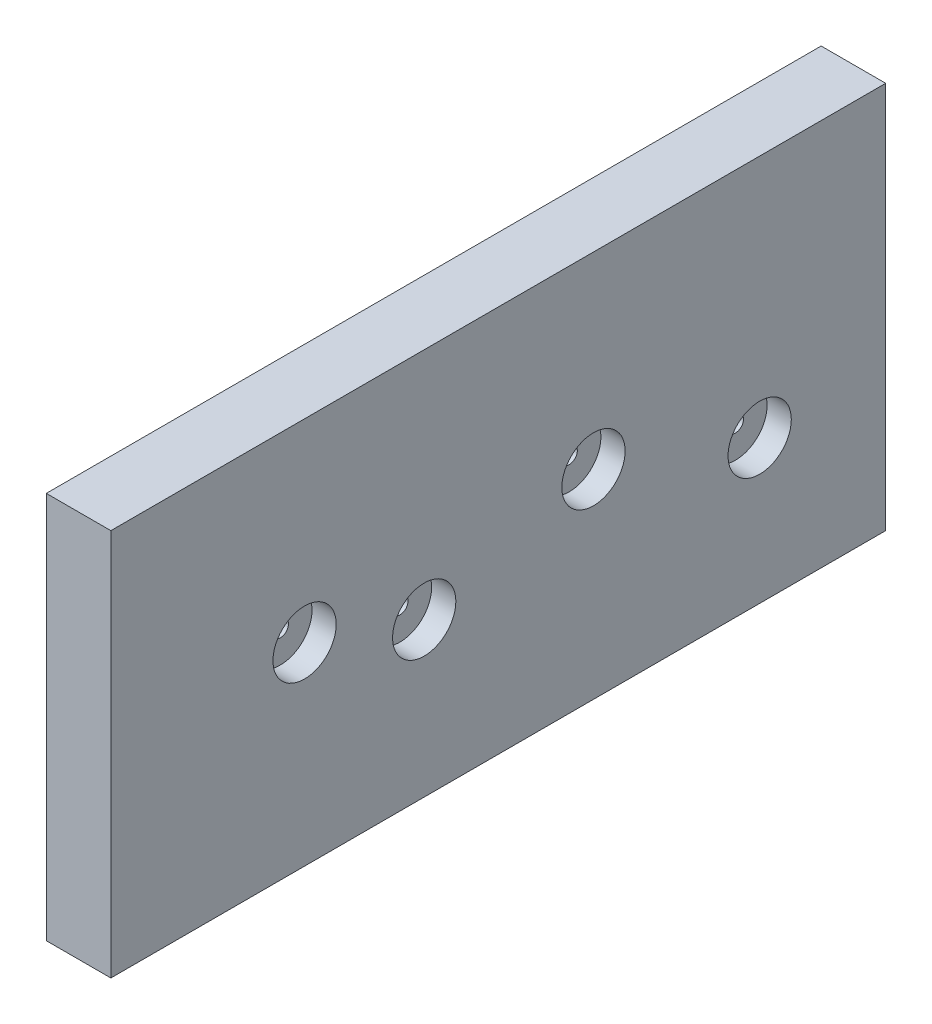
ISO-10303-21;
HEADER;
FILE_DESCRIPTION(('STEP AP214'),'2;1');
FILE_NAME('part.step','',(''),(''),'','','');
FILE_SCHEMA(('AUTOMOTIVE_DESIGN { 1 0 10303 214 1 1 1 1 }'));
ENDSEC;
DATA;
#1=APPLICATION_CONTEXT('core data for automotive mechanical design processes');
#2=APPLICATION_PROTOCOL_DEFINITION('international standard','automotive_design',2000,#1);
#3=PRODUCT_CONTEXT('',#1,'mechanical');
#4=PRODUCT('Part','Part','',(#3));
#5=PRODUCT_RELATED_PRODUCT_CATEGORY('part','',(#4));
#6=PRODUCT_DEFINITION_FORMATION('','',#4);
#7=PRODUCT_DEFINITION_CONTEXT('part definition',#1,'design');
#8=PRODUCT_DEFINITION('design','',#6,#7);
#9=PRODUCT_DEFINITION_SHAPE('','',#8);
#10=(LENGTH_UNIT() NAMED_UNIT(*) SI_UNIT(.MILLI.,.METRE.));
#11=(NAMED_UNIT(*) PLANE_ANGLE_UNIT() SI_UNIT($,.RADIAN.));
#12=(NAMED_UNIT(*) SI_UNIT($,.STERADIAN.) SOLID_ANGLE_UNIT());
#13=UNCERTAINTY_MEASURE_WITH_UNIT(LENGTH_MEASURE(1.E-05),#10,'distance_accuracy_value','');
#14=(GEOMETRIC_REPRESENTATION_CONTEXT(3) GLOBAL_UNCERTAINTY_ASSIGNED_CONTEXT((#13)) GLOBAL_UNIT_ASSIGNED_CONTEXT((#10,
#11,#12)) REPRESENTATION_CONTEXT('',''));
#15=CARTESIAN_POINT('',(0.,0.,0.));
#16=DIRECTION('',(0.,0.,1.));
#17=DIRECTION('',(1.,0.,0.));
#18=AXIS2_PLACEMENT_3D('',#15,#16,#17);
#19=CARTESIAN_POINT('',(12.7,-38.1,0.));
#20=DIRECTION('',(0.,1.,0.));
#21=DIRECTION('',(0.,0.,1.));
#22=AXIS2_PLACEMENT_3D('',#19,#20,#21);
#23=PLANE('',#22);
#24=CARTESIAN_POINT('',(6.35000000000001,-38.1,0.));
#25=DIRECTION('',(0.,-1.,0.));
#26=DIRECTION('',(0.,0.,-1.));
#27=AXIS2_PLACEMENT_3D('',#24,#25,#26);
#28=CIRCLE('',#27,3.175);
#29=CARTESIAN_POINT('',(6.35000000000001,-38.1,-3.175));
#30=VERTEX_POINT('',#29);
#31=EDGE_CURVE('E107',#30,#30,#28,.T.);
#32=ORIENTED_EDGE('',*,*,#31,.F.);
#33=EDGE_LOOP('',(#32));
#34=FACE_BOUND('',#33,.T.);
#35=CARTESIAN_POINT('',(6.35,-38.1,57.15));
#36=DIRECTION('',(0.,-1.,0.));
#37=DIRECTION('',(0.,0.,-1.));
#38=AXIS2_PLACEMENT_3D('',#35,#36,#37);
#39=CIRCLE('',#38,3.175);
#40=CARTESIAN_POINT('',(6.35,-38.1,53.975));
#41=VERTEX_POINT('',#40);
#42=EDGE_CURVE('E106',#41,#41,#39,.T.);
#43=ORIENTED_EDGE('',*,*,#42,.F.);
#44=EDGE_LOOP('',(#43));
#45=FACE_BOUND('',#44,.T.);
#46=CARTESIAN_POINT('',(6.35000000000002,-38.1,-63.5));
#47=DIRECTION('',(0.,-1.,0.));
#48=DIRECTION('',(0.,0.,-1.));
#49=AXIS2_PLACEMENT_3D('',#46,#47,#48);
#50=CIRCLE('',#49,3.175);
#51=CARTESIAN_POINT('',(6.35000000000002,-38.1,-66.675));
#52=VERTEX_POINT('',#51);
#53=EDGE_CURVE('E117',#52,#52,#50,.T.);
#54=ORIENTED_EDGE('',*,*,#53,.F.);
#55=EDGE_LOOP('',(#54));
#56=FACE_BOUND('',#55,.T.);
#57=DIRECTION('',(0.,0.,-1.));
#58=VECTOR('',#57,1.);
#59=CARTESIAN_POINT('',(0.,-38.1,0.));
#60=LINE('',#59,#58);
#61=CARTESIAN_POINT('',(0.,-38.1,76.2));
#62=VERTEX_POINT('',#61);
#63=CARTESIAN_POINT('',(0.,-38.1,-76.2));
#64=VERTEX_POINT('',#63);
#65=EDGE_CURVE('E157',#62,#64,#60,.T.);
#66=ORIENTED_EDGE('',*,*,#65,.T.);
#67=DIRECTION('',(-1.,0.,0.));
#68=VECTOR('',#67,1.);
#69=CARTESIAN_POINT('',(12.7,-38.1,-76.2));
#70=LINE('',#69,#68);
#71=CARTESIAN_POINT('',(12.7,-38.1,-76.2));
#72=VERTEX_POINT('',#71);
#73=EDGE_CURVE('E11',#72,#64,#70,.T.);
#74=ORIENTED_EDGE('',*,*,#73,.F.);
#75=DIRECTION('',(0.,0.,-1.));
#76=VECTOR('',#75,1.);
#77=CARTESIAN_POINT('',(12.7,-38.1,0.));
#78=LINE('',#77,#76);
#79=CARTESIAN_POINT('',(12.7,-38.1,76.2));
#80=VERTEX_POINT('',#79);
#81=EDGE_CURVE('E148',#80,#72,#78,.T.);
#82=ORIENTED_EDGE('',*,*,#81,.F.);
#83=DIRECTION('',(-1.,0.,0.));
#84=VECTOR('',#83,1.);
#85=CARTESIAN_POINT('',(12.7,-38.1,76.2));
#86=LINE('',#85,#84);
#87=EDGE_CURVE('E59',#80,#62,#86,.T.);
#88=ORIENTED_EDGE('',*,*,#87,.T.);
#89=EDGE_LOOP('',(#66,#74,#82,#88));
#90=FACE_BOUND('',#89,.T.);
#91=ADVANCED_FACE('F41',(#34,#45,#56,#90),#23,.F.);
#92=CARTESIAN_POINT('',(12.7,0.,-76.2));
#93=DIRECTION('',(0.,0.,1.));
#94=DIRECTION('',(1.,0.,0.));
#95=AXIS2_PLACEMENT_3D('',#92,#93,#94);
#96=PLANE('',#95);
#97=DIRECTION('',(0.,1.,0.));
#98=VECTOR('',#97,1.);
#99=CARTESIAN_POINT('',(0.,0.,-76.2));
#100=LINE('',#99,#98);
#101=CARTESIAN_POINT('',(0.,38.1,-76.2));
#102=VERTEX_POINT('',#101);
#103=EDGE_CURVE('E159',#64,#102,#100,.T.);
#104=ORIENTED_EDGE('',*,*,#103,.T.);
#105=DIRECTION('',(-1.,0.,0.));
#106=VECTOR('',#105,1.);
#107=CARTESIAN_POINT('',(12.7,38.1,-76.2));
#108=LINE('',#107,#106);
#109=CARTESIAN_POINT('',(12.7,38.1,-76.2));
#110=VERTEX_POINT('',#109);
#111=EDGE_CURVE('E50',#110,#102,#108,.T.);
#112=ORIENTED_EDGE('',*,*,#111,.F.);
#113=DIRECTION('',(0.,1.,0.));
#114=VECTOR('',#113,1.);
#115=CARTESIAN_POINT('',(12.7,0.,-76.2));
#116=LINE('',#115,#114);
#117=EDGE_CURVE('E85',#72,#110,#116,.T.);
#118=ORIENTED_EDGE('',*,*,#117,.F.);
#119=ORIENTED_EDGE('',*,*,#73,.T.);
#120=EDGE_LOOP('',(#104,#112,#118,#119));
#121=FACE_BOUND('',#120,.T.);
#122=ADVANCED_FACE('F229',(#121),#96,.F.);
#123=CARTESIAN_POINT('',(12.7,38.1,0.));
#124=DIRECTION('',(0.,1.,0.));
#125=DIRECTION('',(0.,0.,1.));
#126=AXIS2_PLACEMENT_3D('',#123,#124,#125);
#127=PLANE('',#126);
#128=DIRECTION('',(0.,0.,-1.));
#129=VECTOR('',#128,1.);
#130=CARTESIAN_POINT('',(0.,38.1,0.));
#131=LINE('',#130,#129);
#132=CARTESIAN_POINT('',(0.,38.1,76.2));
#133=VERTEX_POINT('',#132);
#134=EDGE_CURVE('E162',#133,#102,#131,.T.);
#135=ORIENTED_EDGE('',*,*,#134,.F.);
#136=DIRECTION('',(-1.,0.,0.));
#137=VECTOR('',#136,1.);
#138=CARTESIAN_POINT('',(12.7,38.1,76.2));
#139=LINE('',#138,#137);
#140=CARTESIAN_POINT('',(12.7,38.1,76.2));
#141=VERTEX_POINT('',#140);
#142=EDGE_CURVE('E74',#141,#133,#139,.T.);
#143=ORIENTED_EDGE('',*,*,#142,.F.);
#144=DIRECTION('',(0.,0.,-1.));
#145=VECTOR('',#144,1.);
#146=CARTESIAN_POINT('',(12.7,38.1,0.));
#147=LINE('',#146,#145);
#148=EDGE_CURVE('E152',#141,#110,#147,.T.);
#149=ORIENTED_EDGE('',*,*,#148,.T.);
#150=ORIENTED_EDGE('',*,*,#111,.T.);
#151=EDGE_LOOP('',(#135,#143,#149,#150));
#152=FACE_BOUND('',#151,.T.);
#153=ADVANCED_FACE('F200',(#152),#127,.T.);
#154=CARTESIAN_POINT('',(12.7,-9.873506971,-51.4082559918149));
#155=DIRECTION('',(-1.,0.,0.));
#156=DIRECTION('',(0.,0.,1.));
#157=AXIS2_PLACEMENT_3D('',#154,#155,#156);
#158=CYLINDRICAL_SURFACE('',#157,1.5875);
#159=CARTESIAN_POINT('',(7.9375,-9.873506971,-51.4082559918149));
#160=DIRECTION('',(-1.,0.,0.));
#161=DIRECTION('',(0.,0.,1.));
#162=AXIS2_PLACEMENT_3D('',#159,#160,#161);
#163=CIRCLE('',#162,1.5875);
#164=CARTESIAN_POINT('',(7.9375,-9.873506971,-49.8207559918149));
#165=VERTEX_POINT('',#164);
#166=EDGE_CURVE('E44',#165,#165,#163,.T.);
#167=ORIENTED_EDGE('',*,*,#166,.F.);
#168=EDGE_LOOP('',(#167));
#169=FACE_BOUND('',#168,.T.);
#170=CARTESIAN_POINT('',(0.,-9.873506971,-51.4082559918149));
#171=DIRECTION('',(1.,0.,0.));
#172=DIRECTION('',(0.,0.,-1.));
#173=AXIS2_PLACEMENT_3D('',#170,#171,#172);
#174=CIRCLE('',#173,1.5875);
#175=CARTESIAN_POINT('',(0.,-9.873506971,-52.9957559918149));
#176=VERTEX_POINT('',#175);
#177=EDGE_CURVE('E174',#176,#176,#174,.T.);
#178=ORIENTED_EDGE('',*,*,#177,.F.);
#179=EDGE_LOOP('',(#178));
#180=FACE_BOUND('',#179,.T.);
#181=ADVANCED_FACE('F196',(#169,#180),#158,.F.);
#182=CARTESIAN_POINT('',(12.7,1.096077429,-18.7225315801618));
#183=DIRECTION('',(-1.,0.,0.));
#184=DIRECTION('',(0.,0.,1.));
#185=AXIS2_PLACEMENT_3D('',#182,#183,#184);
#186=CYLINDRICAL_SURFACE('',#185,1.5875);
#187=CARTESIAN_POINT('',(7.9375,1.096077429,-18.7225315801618));
#188=DIRECTION('',(-1.,0.,0.));
#189=DIRECTION('',(0.,0.,1.));
#190=AXIS2_PLACEMENT_3D('',#187,#188,#189);
#191=CIRCLE('',#190,1.5875);
#192=CARTESIAN_POINT('',(7.9375,1.096077429,-17.1350315801618));
#193=VERTEX_POINT('',#192);
#194=EDGE_CURVE('E186',#193,#193,#191,.T.);
#195=ORIENTED_EDGE('',*,*,#194,.F.);
#196=EDGE_LOOP('',(#195));
#197=FACE_BOUND('',#196,.T.);
#198=CARTESIAN_POINT('',(0.,1.096077429,-18.7225315801618));
#199=DIRECTION('',(1.,0.,0.));
#200=DIRECTION('',(0.,0.,-1.));
#201=AXIS2_PLACEMENT_3D('',#198,#199,#200);
#202=CIRCLE('',#201,1.5875);
#203=CARTESIAN_POINT('',(0.,1.096077429,-20.3100315801618));
#204=VERTEX_POINT('',#203);
#205=EDGE_CURVE('E171',#204,#204,#202,.T.);
#206=ORIENTED_EDGE('',*,*,#205,.F.);
#207=EDGE_LOOP('',(#206));
#208=FACE_BOUND('',#207,.T.);
#209=ADVANCED_FACE('F199',(#197,#208),#186,.F.);
#210=CARTESIAN_POINT('',(12.7,0.,38.1));
#211=DIRECTION('',(-1.,0.,0.));
#212=DIRECTION('',(0.,0.,1.));
#213=AXIS2_PLACEMENT_3D('',#210,#211,#212);
#214=CYLINDRICAL_SURFACE('',#213,1.5875);
#215=CARTESIAN_POINT('',(7.9375,0.,38.1));
#216=DIRECTION('',(-1.,0.,0.));
#217=DIRECTION('',(0.,0.,1.));
#218=AXIS2_PLACEMENT_3D('',#215,#216,#217);
#219=CIRCLE('',#218,1.5875);
#220=CARTESIAN_POINT('',(7.9375,0.,39.6875));
#221=VERTEX_POINT('',#220);
#222=EDGE_CURVE('E184',#221,#221,#219,.T.);
#223=ORIENTED_EDGE('',*,*,#222,.F.);
#224=EDGE_LOOP('',(#223));
#225=FACE_BOUND('',#224,.T.);
#226=CARTESIAN_POINT('',(0.,0.,38.1));
#227=DIRECTION('',(1.,0.,0.));
#228=DIRECTION('',(0.,0.,-1.));
#229=AXIS2_PLACEMENT_3D('',#226,#227,#228);
#230=CIRCLE('',#229,1.5875);
#231=CARTESIAN_POINT('',(0.,0.,36.5125));
#232=VERTEX_POINT('',#231);
#233=EDGE_CURVE('E168',#232,#232,#230,.T.);
#234=ORIENTED_EDGE('',*,*,#233,.F.);
#235=EDGE_LOOP('',(#234));
#236=FACE_BOUND('',#235,.T.);
#237=ADVANCED_FACE('F225',(#225,#236),#214,.F.);
#238=CARTESIAN_POINT('',(12.7,0.,76.2));
#239=DIRECTION('',(0.,0.,1.));
#240=DIRECTION('',(1.,0.,0.));
#241=AXIS2_PLACEMENT_3D('',#238,#239,#240);
#242=PLANE('',#241);
#243=DIRECTION('',(0.,1.,0.));
#244=VECTOR('',#243,1.);
#245=CARTESIAN_POINT('',(0.,0.,76.2));
#246=LINE('',#245,#244);
#247=EDGE_CURVE('E165',#62,#133,#246,.T.);
#248=ORIENTED_EDGE('',*,*,#247,.F.);
#249=ORIENTED_EDGE('',*,*,#87,.F.);
#250=DIRECTION('',(0.,1.,0.));
#251=VECTOR('',#250,1.);
#252=CARTESIAN_POINT('',(12.7,0.,76.2));
#253=LINE('',#252,#251);
#254=EDGE_CURVE('E155',#80,#141,#253,.T.);
#255=ORIENTED_EDGE('',*,*,#254,.T.);
#256=ORIENTED_EDGE('',*,*,#142,.T.);
#257=EDGE_LOOP('',(#248,#249,#255,#256));
#258=FACE_BOUND('',#257,.T.);
#259=ADVANCED_FACE('F215',(#258),#242,.T.);
#260=CARTESIAN_POINT('',(12.7,-7.860160654,14.5712240149026));
#261=DIRECTION('',(-1.,0.,0.));
#262=DIRECTION('',(0.,0.,1.));
#263=AXIS2_PLACEMENT_3D('',#260,#261,#262);
#264=CYLINDRICAL_SURFACE('',#263,1.5875);
#265=CARTESIAN_POINT('',(7.9375,-7.860160654,14.5712240149026));
#266=DIRECTION('',(-1.,0.,0.));
#267=DIRECTION('',(0.,0.,1.));
#268=AXIS2_PLACEMENT_3D('',#265,#266,#267);
#269=CIRCLE('',#268,1.5875);
#270=CARTESIAN_POINT('',(7.9375,-7.860160654,16.1587240149026));
#271=VERTEX_POINT('',#270);
#272=EDGE_CURVE('E127',#271,#271,#269,.T.);
#273=ORIENTED_EDGE('',*,*,#272,.F.);
#274=EDGE_LOOP('',(#273));
#275=FACE_BOUND('',#274,.T.);
#276=CARTESIAN_POINT('',(0.,-7.860160654,14.5712240149026));
#277=DIRECTION('',(1.,0.,0.));
#278=DIRECTION('',(0.,0.,-1.));
#279=AXIS2_PLACEMENT_3D('',#276,#277,#278);
#280=CIRCLE('',#279,1.5875);
#281=CARTESIAN_POINT('',(0.,-7.860160654,12.9837240149026));
#282=VERTEX_POINT('',#281);
#283=EDGE_CURVE('E150',#282,#282,#280,.T.);
#284=ORIENTED_EDGE('',*,*,#283,.F.);
#285=EDGE_LOOP('',(#284));
#286=FACE_BOUND('',#285,.T.);
#287=ADVANCED_FACE('F213',(#275,#286),#264,.F.);
#288=CARTESIAN_POINT('',(12.7,0.,0.));
#289=DIRECTION('',(1.,0.,0.));
#290=DIRECTION('',(0.,0.,-1.));
#291=AXIS2_PLACEMENT_3D('',#288,#289,#290);
#292=PLANE('',#291);
#293=CARTESIAN_POINT('',(12.7,0.,38.1));
#294=DIRECTION('',(-1.,0.,0.));
#295=DIRECTION('',(0.,0.,1.));
#296=AXIS2_PLACEMENT_3D('',#293,#294,#295);
#297=CIRCLE('',#296,6.223);
#298=CARTESIAN_POINT('',(12.7,0.,31.877));
#299=VERTEX_POINT('',#298);
#300=EDGE_CURVE('E128',#299,#299,#297,.T.);
#301=ORIENTED_EDGE('',*,*,#300,.T.);
#302=EDGE_LOOP('',(#301));
#303=FACE_BOUND('',#302,.T.);
#304=CARTESIAN_POINT('',(12.7,-7.860160654,14.5712240149026));
#305=DIRECTION('',(-1.,0.,0.));
#306=DIRECTION('',(0.,0.,1.));
#307=AXIS2_PLACEMENT_3D('',#304,#305,#306);
#308=CIRCLE('',#307,6.223);
#309=CARTESIAN_POINT('',(12.7,-7.860160654,8.34822401490261));
#310=VERTEX_POINT('',#309);
#311=EDGE_CURVE('E131',#310,#310,#308,.T.);
#312=ORIENTED_EDGE('',*,*,#311,.T.);
#313=EDGE_LOOP('',(#312));
#314=FACE_BOUND('',#313,.T.);
#315=CARTESIAN_POINT('',(12.7,1.096077429,-18.7225315801618));
#316=DIRECTION('',(-1.,0.,0.));
#317=DIRECTION('',(0.,0.,1.));
#318=AXIS2_PLACEMENT_3D('',#315,#316,#317);
#319=CIRCLE('',#318,6.223);
#320=CARTESIAN_POINT('',(12.7,1.096077429,-24.9455315801618));
#321=VERTEX_POINT('',#320);
#322=EDGE_CURVE('E137',#321,#321,#319,.T.);
#323=ORIENTED_EDGE('',*,*,#322,.T.);
#324=EDGE_LOOP('',(#323));
#325=FACE_BOUND('',#324,.T.);
#326=CARTESIAN_POINT('',(12.7,-9.873506971,-51.4082559918149));
#327=DIRECTION('',(-1.,0.,0.));
#328=DIRECTION('',(0.,0.,1.));
#329=AXIS2_PLACEMENT_3D('',#326,#327,#328);
#330=CIRCLE('',#329,6.223);
#331=CARTESIAN_POINT('',(12.7,-9.873506971,-57.6312559918149));
#332=VERTEX_POINT('',#331);
#333=EDGE_CURVE('E143',#332,#332,#330,.T.);
#334=ORIENTED_EDGE('',*,*,#333,.T.);
#335=EDGE_LOOP('',(#334));
#336=FACE_BOUND('',#335,.T.);
#337=ORIENTED_EDGE('',*,*,#81,.T.);
#338=ORIENTED_EDGE('',*,*,#117,.T.);
#339=ORIENTED_EDGE('',*,*,#148,.F.);
#340=ORIENTED_EDGE('',*,*,#254,.F.);
#341=EDGE_LOOP('',(#337,#338,#339,#340));
#342=FACE_BOUND('',#341,.T.);
#343=ADVANCED_FACE('F208',(#303,#314,#325,#336,#342),#292,.T.);
#344=CARTESIAN_POINT('',(0.,0.,0.));
#345=DIRECTION('',(1.,0.,0.));
#346=DIRECTION('',(0.,0.,-1.));
#347=AXIS2_PLACEMENT_3D('',#344,#345,#346);
#348=PLANE('',#347);
#349=ORIENTED_EDGE('',*,*,#65,.F.);
#350=ORIENTED_EDGE('',*,*,#247,.T.);
#351=ORIENTED_EDGE('',*,*,#134,.T.);
#352=ORIENTED_EDGE('',*,*,#103,.F.);
#353=EDGE_LOOP('',(#349,#350,#351,#352));
#354=FACE_BOUND('',#353,.T.);
#355=ORIENTED_EDGE('',*,*,#233,.T.);
#356=EDGE_LOOP('',(#355));
#357=FACE_BOUND('',#356,.T.);
#358=ORIENTED_EDGE('',*,*,#205,.T.);
#359=EDGE_LOOP('',(#358));
#360=FACE_BOUND('',#359,.T.);
#361=ORIENTED_EDGE('',*,*,#177,.T.);
#362=EDGE_LOOP('',(#361));
#363=FACE_BOUND('',#362,.T.);
#364=ORIENTED_EDGE('',*,*,#283,.T.);
#365=EDGE_LOOP('',(#364));
#366=FACE_BOUND('',#365,.T.);
#367=ADVANCED_FACE('F204',(#354,#357,#360,#363,#366),#348,.F.);
#368=CARTESIAN_POINT('',(7.9375,-9.873506971,-51.4082559918149));
#369=DIRECTION('',(1.,0.,0.));
#370=DIRECTION('',(0.,0.,-1.));
#371=AXIS2_PLACEMENT_3D('',#368,#369,#370);
#372=CYLINDRICAL_SURFACE('',#371,6.223);
#373=CARTESIAN_POINT('',(7.9375,-9.873506971,-51.4082559918149));
#374=DIRECTION('',(-1.,0.,0.));
#375=DIRECTION('',(0.,0.,1.));
#376=AXIS2_PLACEMENT_3D('',#373,#374,#375);
#377=CIRCLE('',#376,6.223);
#378=CARTESIAN_POINT('',(7.9375,-9.873506971,-57.6312559918149));
#379=VERTEX_POINT('',#378);
#380=EDGE_CURVE('E123',#379,#379,#377,.T.);
#381=CARTESIAN_POINT('',(7.9375,-9.873506971,-57.6312559918149));
#382=CARTESIAN_POINT('',(7.987109375,-9.873506971,-57.6312559918149));
#383=CARTESIAN_POINT('',(8.03671875,-9.873506971,-57.6312559918149));
#384=CARTESIAN_POINT('',(8.1359375,-9.873506971,-57.6312559918149));
#385=CARTESIAN_POINT('',(8.185546875,-9.873506971,-57.6312559918149));
#386=CARTESIAN_POINT('',(8.284765625,-9.873506971,-57.6312559918149));
#387=CARTESIAN_POINT('',(8.334375,-9.873506971,-57.6312559918149));
#388=CARTESIAN_POINT('',(8.43359375,-9.873506971,-57.6312559918149));
#389=CARTESIAN_POINT('',(8.483203125,-9.873506971,-57.6312559918149));
#390=CARTESIAN_POINT('',(8.582421875,-9.873506971,-57.6312559918149));
#391=CARTESIAN_POINT('',(8.63203125,-9.873506971,-57.6312559918149));
#392=CARTESIAN_POINT('',(8.73125,-9.873506971,-57.6312559918149));
#393=CARTESIAN_POINT('',(8.780859375,-9.873506971,-57.6312559918149));
#394=CARTESIAN_POINT('',(8.880078125,-9.873506971,-57.6312559918149));
#395=CARTESIAN_POINT('',(8.9296875,-9.873506971,-57.6312559918149));
#396=CARTESIAN_POINT('',(9.02890625,-9.873506971,-57.6312559918149));
#397=CARTESIAN_POINT('',(9.078515625,-9.873506971,-57.6312559918149));
#398=CARTESIAN_POINT('',(9.177734375,-9.873506971,-57.6312559918149));
#399=CARTESIAN_POINT('',(9.22734375,-9.873506971,-57.6312559918149));
#400=CARTESIAN_POINT('',(9.3265625,-9.873506971,-57.6312559918149));
#401=CARTESIAN_POINT('',(9.376171875,-9.873506971,-57.6312559918149));
#402=CARTESIAN_POINT('',(9.475390625,-9.873506971,-57.6312559918149));
#403=CARTESIAN_POINT('',(9.525,-9.873506971,-57.6312559918149));
#404=CARTESIAN_POINT('',(9.62421875,-9.873506971,-57.6312559918149));
#405=CARTESIAN_POINT('',(9.673828125,-9.873506971,-57.6312559918149));
#406=CARTESIAN_POINT('',(9.773046875,-9.873506971,-57.6312559918149));
#407=CARTESIAN_POINT('',(9.82265625,-9.873506971,-57.6312559918149));
#408=CARTESIAN_POINT('',(9.921875,-9.873506971,-57.6312559918149));
#409=CARTESIAN_POINT('',(9.971484375,-9.873506971,-57.6312559918149));
#410=CARTESIAN_POINT('',(10.070703125,-9.873506971,-57.6312559918149));
#411=CARTESIAN_POINT('',(10.1203125,-9.873506971,-57.6312559918149));
#412=CARTESIAN_POINT('',(10.21953125,-9.873506971,-57.6312559918149));
#413=CARTESIAN_POINT('',(10.269140625,-9.873506971,-57.6312559918149));
#414=CARTESIAN_POINT('',(10.368359375,-9.873506971,-57.6312559918149));
#415=CARTESIAN_POINT('',(10.41796875,-9.873506971,-57.6312559918149));
#416=CARTESIAN_POINT('',(10.5171875,-9.873506971,-57.6312559918149));
#417=CARTESIAN_POINT('',(10.566796875,-9.873506971,-57.6312559918149));
#418=CARTESIAN_POINT('',(10.666015625,-9.873506971,-57.6312559918149));
#419=CARTESIAN_POINT('',(10.715625,-9.873506971,-57.6312559918149));
#420=CARTESIAN_POINT('',(10.81484375,-9.873506971,-57.6312559918149));
#421=CARTESIAN_POINT('',(10.864453125,-9.873506971,-57.6312559918149));
#422=CARTESIAN_POINT('',(10.963671875,-9.873506971,-57.6312559918149));
#423=CARTESIAN_POINT('',(11.01328125,-9.873506971,-57.6312559918149));
#424=CARTESIAN_POINT('',(11.1125,-9.873506971,-57.6312559918149));
#425=CARTESIAN_POINT('',(11.162109375,-9.873506971,-57.6312559918149));
#426=CARTESIAN_POINT('',(11.261328125,-9.873506971,-57.6312559918149));
#427=CARTESIAN_POINT('',(11.3109375,-9.873506971,-57.6312559918149));
#428=CARTESIAN_POINT('',(11.41015625,-9.873506971,-57.6312559918149));
#429=CARTESIAN_POINT('',(11.459765625,-9.873506971,-57.6312559918149));
#430=CARTESIAN_POINT('',(11.558984375,-9.873506971,-57.6312559918149));
#431=CARTESIAN_POINT('',(11.60859375,-9.873506971,-57.6312559918149));
#432=CARTESIAN_POINT('',(11.7078125,-9.873506971,-57.6312559918149));
#433=CARTESIAN_POINT('',(11.757421875,-9.873506971,-57.6312559918149));
#434=CARTESIAN_POINT('',(11.856640625,-9.873506971,-57.6312559918149));
#435=CARTESIAN_POINT('',(11.90625,-9.873506971,-57.6312559918149));
#436=CARTESIAN_POINT('',(12.00546875,-9.873506971,-57.6312559918149));
#437=CARTESIAN_POINT('',(12.055078125,-9.873506971,-57.6312559918149));
#438=CARTESIAN_POINT('',(12.154296875,-9.873506971,-57.6312559918149));
#439=CARTESIAN_POINT('',(12.20390625,-9.873506971,-57.6312559918149));
#440=CARTESIAN_POINT('',(12.303125,-9.873506971,-57.6312559918149));
#441=CARTESIAN_POINT('',(12.352734375,-9.873506971,-57.6312559918149));
#442=CARTESIAN_POINT('',(12.451953125,-9.873506971,-57.6312559918149));
#443=CARTESIAN_POINT('',(12.5015625,-9.873506971,-57.6312559918149));
#444=CARTESIAN_POINT('',(12.60078125,-9.873506971,-57.6312559918149));
#445=CARTESIAN_POINT('',(12.650390625,-9.873506971,-57.6312559918149));
#446=CARTESIAN_POINT('',(12.7,-9.873506971,-57.6312559918149));
#447=B_SPLINE_CURVE_WITH_KNOTS('',3,(#381,#382,#383,#384,#385,#386,#387,#388,#389,#390,#391,
#392,#393,#394,#395,#396,#397,#398,#399,#400,#401,#402,#403,#404,#405,#406,#407,#408,#409,#410,
#411,#412,#413,#414,#415,#416,#417,#418,#419,#420,#421,#422,#423,#424,#425,#426,#427,#428,#429,
#430,#431,#432,#433,#434,#435,#436,#437,#438,#439,#440,#441,#442,#443,#444,#445,#446),
.UNSPECIFIED.,.F.,.F.,(4,2,2,2,2,2,2,2,2,2,2,2,2,2,2,2,2,2,2,2,2,2,2,2,2,2,2,2,2,2,2,2,4),(0.,
0.148828124999998,0.297656249999998,0.446484374999999,0.595312499999999,0.744140624999999,
0.892968749999999,1.041796875,1.190625,1.339453125,1.48828125,1.637109375,1.7859375,1.934765625,
2.08359375,2.232421875,2.38125,2.530078125,2.67890625,2.827734375,2.9765625,3.125390625,
3.27421875,3.423046875,3.571875,3.720703125,3.86953125,4.018359375,4.1671875,4.316015625,
4.46484375,4.613671875,4.7625),.UNSPECIFIED.);
#448=EDGE_CURVE('BSEAM207',#379,#332,#447,.T.);
#449=ORIENTED_EDGE('',*,*,#380,.T.);
#450=ORIENTED_EDGE('',*,*,#333,.F.);
#451=ORIENTED_EDGE('',*,*,#448,.T.);
#452=ORIENTED_EDGE('',*,*,#448,.F.);
#453=EDGE_LOOP('',(#449,#451,#450,#452));
#454=FACE_BOUND('',#453,.T.);
#455=ADVANCED_FACE('F207',(#454),#372,.F.);
#456=CARTESIAN_POINT('',(7.9375,-9.873506971,-51.4082559918149));
#457=DIRECTION('',(-1.,0.,0.));
#458=DIRECTION('',(0.,0.,1.));
#459=AXIS2_PLACEMENT_3D('',#456,#457,#458);
#460=PLANE('',#459);
#461=ORIENTED_EDGE('',*,*,#166,.T.);
#462=EDGE_LOOP('',(#461));
#463=FACE_BOUND('',#462,.T.);
#464=ORIENTED_EDGE('',*,*,#380,.F.);
#465=EDGE_LOOP('',(#464));
#466=FACE_BOUND('',#465,.T.);
#467=ADVANCED_FACE('F193',(#463,#466),#460,.F.);
#468=CARTESIAN_POINT('',(7.9375,1.096077429,-18.7225315801618));
#469=DIRECTION('',(1.,0.,0.));
#470=DIRECTION('',(0.,0.,-1.));
#471=AXIS2_PLACEMENT_3D('',#468,#469,#470);
#472=CYLINDRICAL_SURFACE('',#471,6.223);
#473=CARTESIAN_POINT('',(7.9375,1.096077429,-18.7225315801618));
#474=DIRECTION('',(-1.,0.,0.));
#475=DIRECTION('',(0.,0.,1.));
#476=AXIS2_PLACEMENT_3D('',#473,#474,#475);
#477=CIRCLE('',#476,6.223);
#478=CARTESIAN_POINT('',(7.9375,1.096077429,-24.9455315801618));
#479=VERTEX_POINT('',#478);
#480=EDGE_CURVE('E140',#479,#479,#477,.T.);
#481=CARTESIAN_POINT('',(7.9375,1.096077429,-24.9455315801618));
#482=CARTESIAN_POINT('',(7.987109375,1.096077429,-24.9455315801618));
#483=CARTESIAN_POINT('',(8.03671875,1.096077429,-24.9455315801618));
#484=CARTESIAN_POINT('',(8.1359375,1.096077429,-24.9455315801618));
#485=CARTESIAN_POINT('',(8.185546875,1.096077429,-24.9455315801618));
#486=CARTESIAN_POINT('',(8.284765625,1.096077429,-24.9455315801618));
#487=CARTESIAN_POINT('',(8.334375,1.096077429,-24.9455315801618));
#488=CARTESIAN_POINT('',(8.43359375,1.096077429,-24.9455315801618));
#489=CARTESIAN_POINT('',(8.483203125,1.096077429,-24.9455315801618));
#490=CARTESIAN_POINT('',(8.582421875,1.096077429,-24.9455315801618));
#491=CARTESIAN_POINT('',(8.63203125,1.096077429,-24.9455315801618));
#492=CARTESIAN_POINT('',(8.73125,1.096077429,-24.9455315801618));
#493=CARTESIAN_POINT('',(8.780859375,1.096077429,-24.9455315801618));
#494=CARTESIAN_POINT('',(8.880078125,1.096077429,-24.9455315801618));
#495=CARTESIAN_POINT('',(8.9296875,1.096077429,-24.9455315801618));
#496=CARTESIAN_POINT('',(9.02890625,1.096077429,-24.9455315801618));
#497=CARTESIAN_POINT('',(9.078515625,1.096077429,-24.9455315801618));
#498=CARTESIAN_POINT('',(9.177734375,1.096077429,-24.9455315801618));
#499=CARTESIAN_POINT('',(9.22734375,1.096077429,-24.9455315801618));
#500=CARTESIAN_POINT('',(9.3265625,1.096077429,-24.9455315801618));
#501=CARTESIAN_POINT('',(9.376171875,1.096077429,-24.9455315801618));
#502=CARTESIAN_POINT('',(9.475390625,1.096077429,-24.9455315801618));
#503=CARTESIAN_POINT('',(9.525,1.096077429,-24.9455315801618));
#504=CARTESIAN_POINT('',(9.62421875,1.096077429,-24.9455315801618));
#505=CARTESIAN_POINT('',(9.673828125,1.096077429,-24.9455315801618));
#506=CARTESIAN_POINT('',(9.773046875,1.096077429,-24.9455315801618));
#507=CARTESIAN_POINT('',(9.82265625,1.096077429,-24.9455315801618));
#508=CARTESIAN_POINT('',(9.921875,1.096077429,-24.9455315801618));
#509=CARTESIAN_POINT('',(9.971484375,1.096077429,-24.9455315801618));
#510=CARTESIAN_POINT('',(10.070703125,1.096077429,-24.9455315801618));
#511=CARTESIAN_POINT('',(10.1203125,1.096077429,-24.9455315801618));
#512=CARTESIAN_POINT('',(10.21953125,1.096077429,-24.9455315801618));
#513=CARTESIAN_POINT('',(10.269140625,1.096077429,-24.9455315801618));
#514=CARTESIAN_POINT('',(10.368359375,1.096077429,-24.9455315801618));
#515=CARTESIAN_POINT('',(10.41796875,1.096077429,-24.9455315801618));
#516=CARTESIAN_POINT('',(10.5171875,1.096077429,-24.9455315801618));
#517=CARTESIAN_POINT('',(10.566796875,1.096077429,-24.9455315801618));
#518=CARTESIAN_POINT('',(10.666015625,1.096077429,-24.9455315801618));
#519=CARTESIAN_POINT('',(10.715625,1.096077429,-24.9455315801618));
#520=CARTESIAN_POINT('',(10.81484375,1.096077429,-24.9455315801618));
#521=CARTESIAN_POINT('',(10.864453125,1.096077429,-24.9455315801618));
#522=CARTESIAN_POINT('',(10.963671875,1.096077429,-24.9455315801618));
#523=CARTESIAN_POINT('',(11.01328125,1.096077429,-24.9455315801618));
#524=CARTESIAN_POINT('',(11.1125,1.096077429,-24.9455315801618));
#525=CARTESIAN_POINT('',(11.162109375,1.096077429,-24.9455315801618));
#526=CARTESIAN_POINT('',(11.261328125,1.096077429,-24.9455315801618));
#527=CARTESIAN_POINT('',(11.3109375,1.096077429,-24.9455315801618));
#528=CARTESIAN_POINT('',(11.41015625,1.096077429,-24.9455315801618));
#529=CARTESIAN_POINT('',(11.459765625,1.096077429,-24.9455315801618));
#530=CARTESIAN_POINT('',(11.558984375,1.096077429,-24.9455315801618));
#531=CARTESIAN_POINT('',(11.60859375,1.096077429,-24.9455315801618));
#532=CARTESIAN_POINT('',(11.7078125,1.096077429,-24.9455315801618));
#533=CARTESIAN_POINT('',(11.757421875,1.096077429,-24.9455315801618));
#534=CARTESIAN_POINT('',(11.856640625,1.096077429,-24.9455315801618));
#535=CARTESIAN_POINT('',(11.90625,1.096077429,-24.9455315801618));
#536=CARTESIAN_POINT('',(12.00546875,1.096077429,-24.9455315801618));
#537=CARTESIAN_POINT('',(12.055078125,1.096077429,-24.9455315801618));
#538=CARTESIAN_POINT('',(12.154296875,1.096077429,-24.9455315801618));
#539=CARTESIAN_POINT('',(12.20390625,1.096077429,-24.9455315801618));
#540=CARTESIAN_POINT('',(12.303125,1.096077429,-24.9455315801618));
#541=CARTESIAN_POINT('',(12.352734375,1.096077429,-24.9455315801618));
#542=CARTESIAN_POINT('',(12.451953125,1.096077429,-24.9455315801618));
#543=CARTESIAN_POINT('',(12.5015625,1.096077429,-24.9455315801618));
#544=CARTESIAN_POINT('',(12.60078125,1.096077429,-24.9455315801618));
#545=CARTESIAN_POINT('',(12.650390625,1.096077429,-24.9455315801618));
#546=CARTESIAN_POINT('',(12.7,1.096077429,-24.9455315801618));
#547=B_SPLINE_CURVE_WITH_KNOTS('',3,(#481,#482,#483,#484,#485,#486,#487,#488,#489,#490,#491,
#492,#493,#494,#495,#496,#497,#498,#499,#500,#501,#502,#503,#504,#505,#506,#507,#508,#509,#510,
#511,#512,#513,#514,#515,#516,#517,#518,#519,#520,#521,#522,#523,#524,#525,#526,#527,#528,#529,
#530,#531,#532,#533,#534,#535,#536,#537,#538,#539,#540,#541,#542,#543,#544,#545,#546),
.UNSPECIFIED.,.F.,.F.,(4,2,2,2,2,2,2,2,2,2,2,2,2,2,2,2,2,2,2,2,2,2,2,2,2,2,2,2,2,2,2,2,4),(0.,
0.148828124999998,0.297656249999998,0.446484374999999,0.595312499999999,0.744140624999999,
0.892968749999999,1.041796875,1.190625,1.339453125,1.48828125,1.637109375,1.7859375,1.934765625,
2.08359375,2.232421875,2.38125,2.530078125,2.67890625,2.827734375,2.9765625,3.125390625,
3.27421875,3.423046875,3.571875,3.720703125,3.86953125,4.018359375,4.1671875,4.316015625,
4.46484375,4.613671875,4.7625),.UNSPECIFIED.);
#548=EDGE_CURVE('BSEAM366',#479,#321,#547,.T.);
#549=ORIENTED_EDGE('',*,*,#480,.T.);
#550=ORIENTED_EDGE('',*,*,#322,.F.);
#551=ORIENTED_EDGE('',*,*,#548,.T.);
#552=ORIENTED_EDGE('',*,*,#548,.F.);
#553=EDGE_LOOP('',(#549,#551,#550,#552));
#554=FACE_BOUND('',#553,.T.);
#555=ADVANCED_FACE('F366',(#554),#472,.F.);
#556=CARTESIAN_POINT('',(7.9375,1.096077429,-18.7225315801618));
#557=DIRECTION('',(-1.,0.,0.));
#558=DIRECTION('',(0.,0.,1.));
#559=AXIS2_PLACEMENT_3D('',#556,#557,#558);
#560=PLANE('',#559);
#561=ORIENTED_EDGE('',*,*,#194,.T.);
#562=EDGE_LOOP('',(#561));
#563=FACE_BOUND('',#562,.T.);
#564=ORIENTED_EDGE('',*,*,#480,.F.);
#565=EDGE_LOOP('',(#564));
#566=FACE_BOUND('',#565,.T.);
#567=ADVANCED_FACE('F375',(#563,#566),#560,.F.);
#568=CARTESIAN_POINT('',(7.9375,-7.860160654,14.5712240149026));
#569=DIRECTION('',(1.,0.,0.));
#570=DIRECTION('',(0.,0.,-1.));
#571=AXIS2_PLACEMENT_3D('',#568,#569,#570);
#572=CYLINDRICAL_SURFACE('',#571,6.223);
#573=CARTESIAN_POINT('',(7.9375,-7.860160654,14.5712240149026));
#574=DIRECTION('',(-1.,0.,0.));
#575=DIRECTION('',(0.,0.,1.));
#576=AXIS2_PLACEMENT_3D('',#573,#574,#575);
#577=CIRCLE('',#576,6.223);
#578=CARTESIAN_POINT('',(7.9375,-7.860160654,8.34822401490261));
#579=VERTEX_POINT('',#578);
#580=EDGE_CURVE('E134',#579,#579,#577,.T.);
#581=CARTESIAN_POINT('',(7.9375,-7.860160654,8.34822401490261));
#582=CARTESIAN_POINT('',(7.987109375,-7.860160654,8.34822401490261));
#583=CARTESIAN_POINT('',(8.03671875,-7.860160654,8.34822401490261));
#584=CARTESIAN_POINT('',(8.1359375,-7.860160654,8.34822401490261));
#585=CARTESIAN_POINT('',(8.185546875,-7.860160654,8.34822401490261));
#586=CARTESIAN_POINT('',(8.284765625,-7.860160654,8.34822401490261));
#587=CARTESIAN_POINT('',(8.334375,-7.860160654,8.34822401490261));
#588=CARTESIAN_POINT('',(8.43359375,-7.860160654,8.34822401490261));
#589=CARTESIAN_POINT('',(8.483203125,-7.860160654,8.34822401490261));
#590=CARTESIAN_POINT('',(8.582421875,-7.860160654,8.34822401490261));
#591=CARTESIAN_POINT('',(8.63203125,-7.860160654,8.34822401490261));
#592=CARTESIAN_POINT('',(8.73125,-7.860160654,8.34822401490261));
#593=CARTESIAN_POINT('',(8.780859375,-7.860160654,8.34822401490261));
#594=CARTESIAN_POINT('',(8.880078125,-7.860160654,8.34822401490261));
#595=CARTESIAN_POINT('',(8.9296875,-7.860160654,8.34822401490261));
#596=CARTESIAN_POINT('',(9.02890625,-7.860160654,8.34822401490261));
#597=CARTESIAN_POINT('',(9.078515625,-7.860160654,8.34822401490261));
#598=CARTESIAN_POINT('',(9.177734375,-7.860160654,8.34822401490261));
#599=CARTESIAN_POINT('',(9.22734375,-7.860160654,8.34822401490261));
#600=CARTESIAN_POINT('',(9.3265625,-7.860160654,8.34822401490261));
#601=CARTESIAN_POINT('',(9.376171875,-7.860160654,8.34822401490261));
#602=CARTESIAN_POINT('',(9.475390625,-7.860160654,8.34822401490261));
#603=CARTESIAN_POINT('',(9.525,-7.860160654,8.34822401490261));
#604=CARTESIAN_POINT('',(9.62421875,-7.860160654,8.34822401490261));
#605=CARTESIAN_POINT('',(9.673828125,-7.860160654,8.34822401490261));
#606=CARTESIAN_POINT('',(9.773046875,-7.860160654,8.34822401490261));
#607=CARTESIAN_POINT('',(9.82265625,-7.860160654,8.34822401490261));
#608=CARTESIAN_POINT('',(9.921875,-7.860160654,8.34822401490261));
#609=CARTESIAN_POINT('',(9.971484375,-7.860160654,8.34822401490261));
#610=CARTESIAN_POINT('',(10.070703125,-7.860160654,8.34822401490261));
#611=CARTESIAN_POINT('',(10.1203125,-7.860160654,8.34822401490261));
#612=CARTESIAN_POINT('',(10.21953125,-7.860160654,8.34822401490261));
#613=CARTESIAN_POINT('',(10.269140625,-7.860160654,8.34822401490261));
#614=CARTESIAN_POINT('',(10.368359375,-7.860160654,8.34822401490261));
#615=CARTESIAN_POINT('',(10.41796875,-7.860160654,8.34822401490261));
#616=CARTESIAN_POINT('',(10.5171875,-7.860160654,8.34822401490261));
#617=CARTESIAN_POINT('',(10.566796875,-7.860160654,8.34822401490261));
#618=CARTESIAN_POINT('',(10.666015625,-7.860160654,8.34822401490261));
#619=CARTESIAN_POINT('',(10.715625,-7.860160654,8.34822401490261));
#620=CARTESIAN_POINT('',(10.81484375,-7.860160654,8.34822401490261));
#621=CARTESIAN_POINT('',(10.864453125,-7.860160654,8.34822401490261));
#622=CARTESIAN_POINT('',(10.963671875,-7.860160654,8.34822401490261));
#623=CARTESIAN_POINT('',(11.01328125,-7.860160654,8.34822401490261));
#624=CARTESIAN_POINT('',(11.1125,-7.860160654,8.34822401490261));
#625=CARTESIAN_POINT('',(11.162109375,-7.860160654,8.34822401490261));
#626=CARTESIAN_POINT('',(11.261328125,-7.860160654,8.34822401490261));
#627=CARTESIAN_POINT('',(11.3109375,-7.860160654,8.34822401490261));
#628=CARTESIAN_POINT('',(11.41015625,-7.860160654,8.34822401490261));
#629=CARTESIAN_POINT('',(11.459765625,-7.860160654,8.34822401490261));
#630=CARTESIAN_POINT('',(11.558984375,-7.860160654,8.34822401490261));
#631=CARTESIAN_POINT('',(11.60859375,-7.860160654,8.34822401490261));
#632=CARTESIAN_POINT('',(11.7078125,-7.860160654,8.34822401490261));
#633=CARTESIAN_POINT('',(11.757421875,-7.860160654,8.34822401490261));
#634=CARTESIAN_POINT('',(11.856640625,-7.860160654,8.34822401490261));
#635=CARTESIAN_POINT('',(11.90625,-7.860160654,8.34822401490261));
#636=CARTESIAN_POINT('',(12.00546875,-7.860160654,8.34822401490261));
#637=CARTESIAN_POINT('',(12.055078125,-7.860160654,8.34822401490261));
#638=CARTESIAN_POINT('',(12.154296875,-7.860160654,8.34822401490261));
#639=CARTESIAN_POINT('',(12.20390625,-7.860160654,8.34822401490261));
#640=CARTESIAN_POINT('',(12.303125,-7.860160654,8.34822401490261));
#641=CARTESIAN_POINT('',(12.352734375,-7.860160654,8.34822401490261));
#642=CARTESIAN_POINT('',(12.451953125,-7.860160654,8.34822401490261));
#643=CARTESIAN_POINT('',(12.5015625,-7.860160654,8.34822401490261));
#644=CARTESIAN_POINT('',(12.60078125,-7.860160654,8.34822401490261));
#645=CARTESIAN_POINT('',(12.650390625,-7.860160654,8.34822401490261));
#646=CARTESIAN_POINT('',(12.7,-7.860160654,8.34822401490261));
#647=B_SPLINE_CURVE_WITH_KNOTS('',3,(#581,#582,#583,#584,#585,#586,#587,#588,#589,#590,#591,
#592,#593,#594,#595,#596,#597,#598,#599,#600,#601,#602,#603,#604,#605,#606,#607,#608,#609,#610,
#611,#612,#613,#614,#615,#616,#617,#618,#619,#620,#621,#622,#623,#624,#625,#626,#627,#628,#629,
#630,#631,#632,#633,#634,#635,#636,#637,#638,#639,#640,#641,#642,#643,#644,#645,#646),
.UNSPECIFIED.,.F.,.F.,(4,2,2,2,2,2,2,2,2,2,2,2,2,2,2,2,2,2,2,2,2,2,2,2,2,2,2,2,2,2,2,2,4),(0.,
0.148828124999998,0.297656249999998,0.446484374999999,0.595312499999999,0.744140624999999,
0.892968749999999,1.041796875,1.190625,1.339453125,1.48828125,1.637109375,1.7859375,1.934765625,
2.08359375,2.232421875,2.38125,2.530078125,2.67890625,2.827734375,2.9765625,3.125390625,
3.27421875,3.423046875,3.571875,3.720703125,3.86953125,4.018359375,4.1671875,4.316015625,
4.46484375,4.613671875,4.7625),.UNSPECIFIED.);
#648=EDGE_CURVE('BSEAM385',#579,#310,#647,.T.);
#649=ORIENTED_EDGE('',*,*,#580,.T.);
#650=ORIENTED_EDGE('',*,*,#311,.F.);
#651=ORIENTED_EDGE('',*,*,#648,.T.);
#652=ORIENTED_EDGE('',*,*,#648,.F.);
#653=EDGE_LOOP('',(#649,#651,#650,#652));
#654=FACE_BOUND('',#653,.T.);
#655=ADVANCED_FACE('F385',(#654),#572,.F.);
#656=CARTESIAN_POINT('',(7.9375,-7.860160654,14.5712240149026));
#657=DIRECTION('',(-1.,0.,0.));
#658=DIRECTION('',(0.,0.,1.));
#659=AXIS2_PLACEMENT_3D('',#656,#657,#658);
#660=PLANE('',#659);
#661=ORIENTED_EDGE('',*,*,#272,.T.);
#662=EDGE_LOOP('',(#661));
#663=FACE_BOUND('',#662,.T.);
#664=ORIENTED_EDGE('',*,*,#580,.F.);
#665=EDGE_LOOP('',(#664));
#666=FACE_BOUND('',#665,.T.);
#667=ADVANCED_FACE('F394',(#663,#666),#660,.F.);
#668=CARTESIAN_POINT('',(7.9375,0.,38.1));
#669=DIRECTION('',(1.,0.,0.));
#670=DIRECTION('',(0.,0.,-1.));
#671=AXIS2_PLACEMENT_3D('',#668,#669,#670);
#672=CYLINDRICAL_SURFACE('',#671,6.223);
#673=CARTESIAN_POINT('',(7.9375,0.,38.1));
#674=DIRECTION('',(-1.,0.,0.));
#675=DIRECTION('',(0.,0.,1.));
#676=AXIS2_PLACEMENT_3D('',#673,#674,#675);
#677=CIRCLE('',#676,6.223);
#678=CARTESIAN_POINT('',(7.9375,0.,31.877));
#679=VERTEX_POINT('',#678);
#680=EDGE_CURVE('E124',#679,#679,#677,.T.);
#681=CARTESIAN_POINT('',(7.9375,0.,31.877));
#682=CARTESIAN_POINT('',(7.987109375,0.,31.877));
#683=CARTESIAN_POINT('',(8.03671875,0.,31.877));
#684=CARTESIAN_POINT('',(8.1359375,0.,31.877));
#685=CARTESIAN_POINT('',(8.185546875,0.,31.877));
#686=CARTESIAN_POINT('',(8.284765625,0.,31.877));
#687=CARTESIAN_POINT('',(8.334375,0.,31.877));
#688=CARTESIAN_POINT('',(8.43359375,0.,31.877));
#689=CARTESIAN_POINT('',(8.483203125,0.,31.877));
#690=CARTESIAN_POINT('',(8.582421875,0.,31.877));
#691=CARTESIAN_POINT('',(8.63203125,0.,31.877));
#692=CARTESIAN_POINT('',(8.73125,0.,31.877));
#693=CARTESIAN_POINT('',(8.780859375,0.,31.877));
#694=CARTESIAN_POINT('',(8.880078125,0.,31.877));
#695=CARTESIAN_POINT('',(8.9296875,0.,31.877));
#696=CARTESIAN_POINT('',(9.02890625,0.,31.877));
#697=CARTESIAN_POINT('',(9.078515625,0.,31.877));
#698=CARTESIAN_POINT('',(9.177734375,0.,31.877));
#699=CARTESIAN_POINT('',(9.22734375,0.,31.877));
#700=CARTESIAN_POINT('',(9.3265625,0.,31.877));
#701=CARTESIAN_POINT('',(9.376171875,0.,31.877));
#702=CARTESIAN_POINT('',(9.475390625,0.,31.877));
#703=CARTESIAN_POINT('',(9.525,0.,31.877));
#704=CARTESIAN_POINT('',(9.62421875,0.,31.877));
#705=CARTESIAN_POINT('',(9.673828125,0.,31.877));
#706=CARTESIAN_POINT('',(9.773046875,0.,31.877));
#707=CARTESIAN_POINT('',(9.82265625,0.,31.877));
#708=CARTESIAN_POINT('',(9.921875,0.,31.877));
#709=CARTESIAN_POINT('',(9.971484375,0.,31.877));
#710=CARTESIAN_POINT('',(10.070703125,0.,31.877));
#711=CARTESIAN_POINT('',(10.1203125,0.,31.877));
#712=CARTESIAN_POINT('',(10.21953125,0.,31.877));
#713=CARTESIAN_POINT('',(10.269140625,0.,31.877));
#714=CARTESIAN_POINT('',(10.368359375,0.,31.877));
#715=CARTESIAN_POINT('',(10.41796875,0.,31.877));
#716=CARTESIAN_POINT('',(10.5171875,0.,31.877));
#717=CARTESIAN_POINT('',(10.566796875,0.,31.877));
#718=CARTESIAN_POINT('',(10.666015625,0.,31.877));
#719=CARTESIAN_POINT('',(10.715625,0.,31.877));
#720=CARTESIAN_POINT('',(10.81484375,0.,31.877));
#721=CARTESIAN_POINT('',(10.864453125,0.,31.877));
#722=CARTESIAN_POINT('',(10.963671875,0.,31.877));
#723=CARTESIAN_POINT('',(11.01328125,0.,31.877));
#724=CARTESIAN_POINT('',(11.1125,0.,31.877));
#725=CARTESIAN_POINT('',(11.162109375,0.,31.877));
#726=CARTESIAN_POINT('',(11.261328125,0.,31.877));
#727=CARTESIAN_POINT('',(11.3109375,0.,31.877));
#728=CARTESIAN_POINT('',(11.41015625,0.,31.877));
#729=CARTESIAN_POINT('',(11.459765625,0.,31.877));
#730=CARTESIAN_POINT('',(11.558984375,0.,31.877));
#731=CARTESIAN_POINT('',(11.60859375,0.,31.877));
#732=CARTESIAN_POINT('',(11.7078125,0.,31.877));
#733=CARTESIAN_POINT('',(11.757421875,0.,31.877));
#734=CARTESIAN_POINT('',(11.856640625,0.,31.877));
#735=CARTESIAN_POINT('',(11.90625,0.,31.877));
#736=CARTESIAN_POINT('',(12.00546875,0.,31.877));
#737=CARTESIAN_POINT('',(12.055078125,0.,31.877));
#738=CARTESIAN_POINT('',(12.154296875,0.,31.877));
#739=CARTESIAN_POINT('',(12.20390625,0.,31.877));
#740=CARTESIAN_POINT('',(12.303125,0.,31.877));
#741=CARTESIAN_POINT('',(12.352734375,0.,31.877));
#742=CARTESIAN_POINT('',(12.451953125,0.,31.877));
#743=CARTESIAN_POINT('',(12.5015625,0.,31.877));
#744=CARTESIAN_POINT('',(12.60078125,0.,31.877));
#745=CARTESIAN_POINT('',(12.650390625,0.,31.877));
#746=CARTESIAN_POINT('',(12.7,0.,31.877));
#747=B_SPLINE_CURVE_WITH_KNOTS('',3,(#681,#682,#683,#684,#685,#686,#687,#688,#689,#690,#691,
#692,#693,#694,#695,#696,#697,#698,#699,#700,#701,#702,#703,#704,#705,#706,#707,#708,#709,#710,
#711,#712,#713,#714,#715,#716,#717,#718,#719,#720,#721,#722,#723,#724,#725,#726,#727,#728,#729,
#730,#731,#732,#733,#734,#735,#736,#737,#738,#739,#740,#741,#742,#743,#744,#745,#746),
.UNSPECIFIED.,.F.,.F.,(4,2,2,2,2,2,2,2,2,2,2,2,2,2,2,2,2,2,2,2,2,2,2,2,2,2,2,2,2,2,2,2,4),(0.,
0.148828124999998,0.297656249999998,0.446484374999999,0.595312499999999,0.744140624999999,
0.892968749999999,1.041796875,1.190625,1.339453125,1.48828125,1.637109375,1.7859375,1.934765625,
2.08359375,2.232421875,2.38125,2.530078125,2.67890625,2.827734375,2.9765625,3.125390625,
3.27421875,3.423046875,3.571875,3.720703125,3.86953125,4.018359375,4.1671875,4.316015625,
4.46484375,4.613671875,4.7625),.UNSPECIFIED.);
#748=EDGE_CURVE('BSEAM404',#679,#299,#747,.T.);
#749=ORIENTED_EDGE('',*,*,#680,.T.);
#750=ORIENTED_EDGE('',*,*,#300,.F.);
#751=ORIENTED_EDGE('',*,*,#748,.T.);
#752=ORIENTED_EDGE('',*,*,#748,.F.);
#753=EDGE_LOOP('',(#749,#751,#750,#752));
#754=FACE_BOUND('',#753,.T.);
#755=ADVANCED_FACE('F404',(#754),#672,.F.);
#756=CARTESIAN_POINT('',(7.9375,0.,38.1));
#757=DIRECTION('',(-1.,0.,0.));
#758=DIRECTION('',(0.,0.,1.));
#759=AXIS2_PLACEMENT_3D('',#756,#757,#758);
#760=PLANE('',#759);
#761=ORIENTED_EDGE('',*,*,#222,.T.);
#762=EDGE_LOOP('',(#761));
#763=FACE_BOUND('',#762,.T.);
#764=ORIENTED_EDGE('',*,*,#680,.F.);
#765=EDGE_LOOP('',(#764));
#766=FACE_BOUND('',#765,.T.);
#767=ADVANCED_FACE('F414',(#763,#766),#760,.F.);
#768=CARTESIAN_POINT('',(6.35000000000002,0.,-63.5));
#769=DIRECTION('',(0.,-1.,0.));
#770=DIRECTION('',(0.,0.,-1.));
#771=AXIS2_PLACEMENT_3D('',#768,#769,#770);
#772=CONICAL_SURFACE('',#771,3.17499999999999,1.02974425867665);
#773=CARTESIAN_POINT('',(6.35000000000001,1.9077324654125,-63.5));
#774=VERTEX_POINT('',#773);
#775=VERTEX_LOOP('',#774);
#776=FACE_BOUND('',#775,.T.);
#777=CARTESIAN_POINT('',(6.35000000000002,0.,-63.5));
#778=DIRECTION('',(0.,-1.,0.));
#779=DIRECTION('',(0.,0.,-1.));
#780=AXIS2_PLACEMENT_3D('',#777,#778,#779);
#781=CIRCLE('',#780,3.17499999999999);
#782=CARTESIAN_POINT('',(6.35000000000002,0.,-66.675));
#783=VERTEX_POINT('',#782);
#784=EDGE_CURVE('E120',#783,#783,#781,.T.);
#785=ORIENTED_EDGE('',*,*,#784,.T.);
#786=EDGE_LOOP('',(#785));
#787=FACE_BOUND('',#786,.T.);
#788=ADVANCED_FACE('F423',(#776,#787),#772,.F.);
#789=CARTESIAN_POINT('',(6.35000000000002,-38.1,-63.5));
#790=DIRECTION('',(0.,-1.,0.));
#791=DIRECTION('',(0.,0.,-1.));
#792=AXIS2_PLACEMENT_3D('',#789,#790,#791);
#793=CYLINDRICAL_SURFACE('',#792,3.17499999999999);
#794=ORIENTED_EDGE('',*,*,#784,.F.);
#795=EDGE_LOOP('',(#794));
#796=FACE_BOUND('',#795,.T.);
#797=ORIENTED_EDGE('',*,*,#53,.T.);
#798=EDGE_LOOP('',(#797));
#799=FACE_BOUND('',#798,.T.);
#800=ADVANCED_FACE('F432',(#796,#799),#793,.F.);
#801=CARTESIAN_POINT('',(6.35,0.,57.15));
#802=DIRECTION('',(0.,-1.,0.));
#803=DIRECTION('',(0.,0.,-1.));
#804=AXIS2_PLACEMENT_3D('',#801,#802,#803);
#805=CONICAL_SURFACE('',#804,3.17499999999999,1.02974425867665);
#806=CARTESIAN_POINT('',(6.34999999999999,1.9077324654125,57.15));
#807=VERTEX_POINT('',#806);
#808=VERTEX_LOOP('',#807);
#809=FACE_BOUND('',#808,.T.);
#810=CARTESIAN_POINT('',(6.35,0.,57.15));
#811=DIRECTION('',(0.,-1.,0.));
#812=DIRECTION('',(0.,0.,-1.));
#813=AXIS2_PLACEMENT_3D('',#810,#811,#812);
#814=CIRCLE('',#813,3.17499999999999);
#815=CARTESIAN_POINT('',(6.35,0.,53.975));
#816=VERTEX_POINT('',#815);
#817=EDGE_CURVE('E110',#816,#816,#814,.T.);
#818=ORIENTED_EDGE('',*,*,#817,.T.);
#819=EDGE_LOOP('',(#818));
#820=FACE_BOUND('',#819,.T.);
#821=ADVANCED_FACE('F442',(#809,#820),#805,.F.);
#822=CARTESIAN_POINT('',(6.35,-38.1,57.15));
#823=DIRECTION('',(0.,-1.,0.));
#824=DIRECTION('',(0.,0.,-1.));
#825=AXIS2_PLACEMENT_3D('',#822,#823,#824);
#826=CYLINDRICAL_SURFACE('',#825,3.175);
#827=ORIENTED_EDGE('',*,*,#817,.F.);
#828=EDGE_LOOP('',(#827));
#829=FACE_BOUND('',#828,.T.);
#830=ORIENTED_EDGE('',*,*,#42,.T.);
#831=EDGE_LOOP('',(#830));
#832=FACE_BOUND('',#831,.T.);
#833=ADVANCED_FACE('F100',(#829,#832),#826,.F.);
#834=CARTESIAN_POINT('',(6.35000000000001,0.,0.));
#835=DIRECTION('',(0.,-1.,0.));
#836=DIRECTION('',(0.,0.,-1.));
#837=AXIS2_PLACEMENT_3D('',#834,#835,#836);
#838=CONICAL_SURFACE('',#837,3.17499999999999,1.02974425867665);
#839=CARTESIAN_POINT('',(6.35,1.9077324654125,0.));
#840=VERTEX_POINT('',#839);
#841=VERTEX_LOOP('',#840);
#842=FACE_BOUND('',#841,.T.);
#843=CARTESIAN_POINT('',(6.35000000000001,0.,0.));
#844=DIRECTION('',(0.,-1.,0.));
#845=DIRECTION('',(0.,0.,-1.));
#846=AXIS2_PLACEMENT_3D('',#843,#844,#845);
#847=CIRCLE('',#846,3.17499999999999);
#848=CARTESIAN_POINT('',(6.35000000000001,0.,-3.17499999999999));
#849=VERTEX_POINT('',#848);
#850=EDGE_CURVE('E104',#849,#849,#847,.T.);
#851=ORIENTED_EDGE('',*,*,#850,.T.);
#852=EDGE_LOOP('',(#851));
#853=FACE_BOUND('',#852,.T.);
#854=ADVANCED_FACE('F96',(#842,#853),#838,.F.);
#855=CARTESIAN_POINT('',(6.35000000000001,-38.1,0.));
#856=DIRECTION('',(0.,-1.,0.));
#857=DIRECTION('',(0.,0.,-1.));
#858=AXIS2_PLACEMENT_3D('',#855,#856,#857);
#859=CYLINDRICAL_SURFACE('',#858,3.175);
#860=ORIENTED_EDGE('',*,*,#850,.F.);
#861=EDGE_LOOP('',(#860));
#862=FACE_BOUND('',#861,.T.);
#863=ORIENTED_EDGE('',*,*,#31,.T.);
#864=EDGE_LOOP('',(#863));
#865=FACE_BOUND('',#864,.T.);
#866=ADVANCED_FACE('F99',(#862,#865),#859,.F.);
#867=CLOSED_SHELL('',(#91,#122,#153,#181,#209,#237,#259,#287,#343,#367,#455,#467,#555,#567,#655,
#667,#755,#767,#788,#800,#821,#833,#854,#866));
#868=MANIFOLD_SOLID_BREP('B2',#867);
#869=ADVANCED_BREP_SHAPE_REPRESENTATION('',(#18,#868),#14);
#870=SHAPE_DEFINITION_REPRESENTATION(#9,#869);
ENDSEC;
END-ISO-10303-21;
